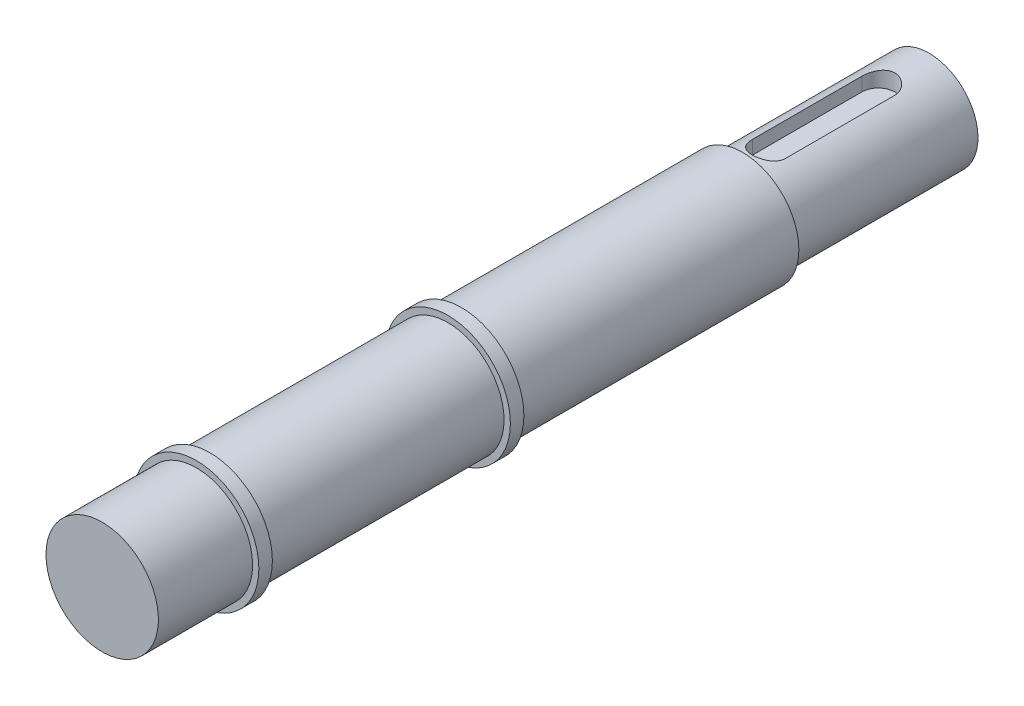
ISO-10303-21;
HEADER;
FILE_DESCRIPTION(('STEP AP214'),'2;1');
FILE_NAME('part.step','',(''),(''),'','','');
FILE_SCHEMA(('AUTOMOTIVE_DESIGN { 1 0 10303 214 1 1 1 1 }'));
ENDSEC;
DATA;
#1=APPLICATION_CONTEXT('core data for automotive mechanical design processes');
#2=APPLICATION_PROTOCOL_DEFINITION('international standard','automotive_design',2000,#1);
#3=PRODUCT_CONTEXT('',#1,'mechanical');
#4=PRODUCT('Part','Part','',(#3));
#5=PRODUCT_RELATED_PRODUCT_CATEGORY('part','',(#4));
#6=PRODUCT_DEFINITION_FORMATION('','',#4);
#7=PRODUCT_DEFINITION_CONTEXT('part definition',#1,'design');
#8=PRODUCT_DEFINITION('design','',#6,#7);
#9=PRODUCT_DEFINITION_SHAPE('','',#8);
#10=(LENGTH_UNIT() NAMED_UNIT(*) SI_UNIT(.MILLI.,.METRE.));
#11=(NAMED_UNIT(*) PLANE_ANGLE_UNIT() SI_UNIT($,.RADIAN.));
#12=(NAMED_UNIT(*) SI_UNIT($,.STERADIAN.) SOLID_ANGLE_UNIT());
#13=UNCERTAINTY_MEASURE_WITH_UNIT(LENGTH_MEASURE(1.E-05),#10,'distance_accuracy_value','');
#14=(GEOMETRIC_REPRESENTATION_CONTEXT(3) GLOBAL_UNCERTAINTY_ASSIGNED_CONTEXT((#13)) GLOBAL_UNIT_ASSIGNED_CONTEXT((#10,
#11,#12)) REPRESENTATION_CONTEXT('',''));
#15=CARTESIAN_POINT('',(0.,0.,0.));
#16=DIRECTION('',(0.,0.,1.));
#17=DIRECTION('',(1.,0.,0.));
#18=AXIS2_PLACEMENT_3D('',#15,#16,#17);
#19=CARTESIAN_POINT('',(0.,0.,28.2));
#20=DIRECTION('',(0.,0.,-1.));
#21=DIRECTION('',(-1.,0.,0.));
#22=AXIS2_PLACEMENT_3D('',#19,#20,#21);
#23=CYLINDRICAL_SURFACE('',#22,7.4);
#24=DIRECTION('',(0.,0.,-1.));
#25=VECTOR('',#24,1.);
#26=CARTESIAN_POINT('',(2.5,6.96491205974634,28.2));
#27=LINE('',#26,#25);
#28=CARTESIAN_POINT('',(2.5,6.96491205974634,7.68));
#29=VERTEX_POINT('',#28);
#30=CARTESIAN_POINT('',(2.5,6.96491205974634,24.22));
#31=VERTEX_POINT('',#30);
#32=EDGE_CURVE('E11',#29,#31,#27,.F.);
#33=ORIENTED_EDGE('',*,*,#32,.T.);
#34=CARTESIAN_POINT('',(2.5,6.96491205974634,24.22));
#35=CARTESIAN_POINT('',(2.50000905201508,6.96490099553564,24.2881487457083));
#36=CARTESIAN_POINT('',(2.49721364918644,6.96591201051966,24.3562913237092));
#37=CARTESIAN_POINT('',(2.48608446544295,6.96989582076334,24.4920466583324));
#38=CARTESIAN_POINT('',(2.477752216073,6.9728680735242,24.559659556238));
#39=CARTESIAN_POINT('',(2.45565314341074,6.98068027824519,24.6936740733216));
#40=CARTESIAN_POINT('',(2.44190277101499,6.9855145755412,24.7600787284107));
#41=CARTESIAN_POINT('',(2.4091090544519,6.9968916649086,24.891401469386));
#42=CARTESIAN_POINT('',(2.39006551123127,7.00343452123096,24.9563194992674));
#43=CARTESIAN_POINT('',(2.3252510474556,7.02533354142691,25.1480996033513));
#44=CARTESIAN_POINT('',(2.27176245812699,7.04297288735097,25.2721903451324));
#45=CARTESIAN_POINT('',(2.1459008277996,7.08233245659287,25.5096574609637));
#46=CARTESIAN_POINT('',(2.07351579187872,7.10405526951789,25.6230269669881));
#47=CARTESIAN_POINT('',(1.90880619240687,7.15010622199947,25.8404039046637));
#48=CARTESIAN_POINT('',(1.81585339491792,7.17450029768077,25.9439223346005));
#49=CARTESIAN_POINT('',(1.61398835009127,7.22258918638203,26.1342345624955));
#50=CARTESIAN_POINT('',(1.50507324397857,7.24628387322957,26.2210253581528));
#51=CARTESIAN_POINT('',(1.27075774894395,7.29107390182166,26.3776734405403));
#52=CARTESIAN_POINT('',(1.14499277113211,7.31208219485036,26.4470125212592));
#53=CARTESIAN_POINT('',(0.882756710640086,7.34834863330584,26.5633520209235));
#54=CARTESIAN_POINT('',(0.746288987487378,7.36360857444689,26.6103594172122));
#55=CARTESIAN_POINT('',(0.471681326765319,7.38619052820582,26.6790296926152));
#56=CARTESIAN_POINT('',(0.333774516869893,7.39377617782154,26.7015365024354));
#57=CARTESIAN_POINT('',(0.0559443345347075,7.40109182518934,26.7232522816952));
#58=CARTESIAN_POINT('',(-0.0839785347765379,7.4008237501077,26.7224669666132));
#59=CARTESIAN_POINT('',(-0.355883067176352,7.39263937184996,26.6981507005727));
#60=CARTESIAN_POINT('',(-0.487957589052036,7.38503155390528,26.6755371574892));
#61=CARTESIAN_POINT('',(-0.746311417471459,7.36341175453473,26.6097265113034));
#62=CARTESIAN_POINT('',(-0.872590400686251,7.34939941628203,26.5665282613215));
#63=CARTESIAN_POINT('',(-1.11775267963212,7.31615674421397,26.4602503137716));
#64=CARTESIAN_POINT('',(-1.2365149212717,7.29685933030961,26.3969132180546));
#65=CARTESIAN_POINT('',(-1.46199280086729,7.25504968839476,26.2523689154533));
#66=CARTESIAN_POINT('',(-1.56870507453878,7.23253656653045,26.1711567365175));
#67=CARTESIAN_POINT('',(-1.772498321968,7.18538231878151,25.9885745912751));
#68=CARTESIAN_POINT('',(-1.86886721852632,7.16069092634078,25.8864217381312));
#69=CARTESIAN_POINT('',(-2.04335729677368,7.11286852392247,25.6671773597069));
#70=CARTESIAN_POINT('',(-2.12147247820508,7.08973802880621,25.550080941764));
#71=CARTESIAN_POINT('',(-2.25827380149303,7.04737003113004,25.3019363479464));
#72=CARTESIAN_POINT('',(-2.31664000866284,7.02819843072747,25.1707000440184));
#73=CARTESIAN_POINT('',(-2.41013378070368,6.99669406129353,24.8995176564333));
#74=CARTESIAN_POINT('',(-2.44529822962789,6.9843504428298,24.759585785638));
#75=CARTESIAN_POINT('',(-2.47876836120455,6.97250403910819,24.5519003570336));
#76=CARTESIAN_POINT('',(-2.48672657738471,6.96966537453545,24.4857634688176));
#77=CARTESIAN_POINT('',(-2.49733912303956,6.96586795311158,24.3530962991924));
#78=CARTESIAN_POINT('',(-2.50000013259014,6.9649068286053,24.2865666194979));
#79=CARTESIAN_POINT('',(-2.5,6.96491205974634,24.22));
#80=B_SPLINE_CURVE_WITH_KNOTS('',3,(#34,#35,#36,#37,#38,#39,#40,#41,#42,#43,#44,#45,#46,#47,#48,
#49,#50,#51,#52,#53,#54,#55,#56,#57,#58,#59,#60,#61,#62,#63,#64,#65,#66,#67,#68,#69,#70,#71,#72,
#73,#74,#75,#76,#77,#78,#79),.UNSPECIFIED.,.F.,.F.,(4,2,2,2,2,2,2,2,2,2,2,2,2,2,2,2,2,2,2,2,2,2,
4),(0.,0.204371018640674,0.408685529814375,0.612384408444618,0.8160909483459,1.22289423224872,
1.62995637376861,2.05178960782396,2.4736984827744,2.90695459585444,3.34007525260528,
3.75775237270153,4.17532700301721,4.57608283473384,4.97686099722023,5.38298269457204,
5.78921749996541,6.21503140184729,6.6409850785764,7.07354137650675,7.50540836815663,
7.70522789621864,7.90479528057056),.UNSPECIFIED.);
#81=CARTESIAN_POINT('',(-2.5,6.96491205974634,24.22));
#82=VERTEX_POINT('',#81);
#83=EDGE_CURVE('E113',#31,#82,#80,.T.);
#84=ORIENTED_EDGE('',*,*,#83,.T.);
#85=DIRECTION('',(0.,0.,-1.));
#86=VECTOR('',#85,1.);
#87=CARTESIAN_POINT('',(-2.5,6.96491205974634,28.2));
#88=LINE('',#87,#86);
#89=CARTESIAN_POINT('',(-2.5,6.96491205974634,7.68));
#90=VERTEX_POINT('',#89);
#91=EDGE_CURVE('E45',#82,#90,#88,.T.);
#92=ORIENTED_EDGE('',*,*,#91,.T.);
#93=CARTESIAN_POINT('',(-2.5,6.96491205974634,7.68));
#94=CARTESIAN_POINT('',(-2.50000905201508,6.96490099553564,7.61185125429169));
#95=CARTESIAN_POINT('',(-2.49721364918644,6.96591201051967,7.54370867629081));
#96=CARTESIAN_POINT('',(-2.48608446544294,6.96989582076334,7.4079533416676));
#97=CARTESIAN_POINT('',(-2.47775221607299,6.9728680735242,7.340340443762));
#98=CARTESIAN_POINT('',(-2.45565314341073,6.98068027824519,7.20632592667837));
#99=CARTESIAN_POINT('',(-2.44190277101499,6.9855145755412,7.13992127158931));
#100=CARTESIAN_POINT('',(-2.4091090544519,6.9968916649086,7.00859853061398));
#101=CARTESIAN_POINT('',(-2.39006551123127,7.00343452123096,6.94368050073264));
#102=CARTESIAN_POINT('',(-2.3252510474556,7.02533354142691,6.75190039664868));
#103=CARTESIAN_POINT('',(-2.27176245812698,7.04297288735097,6.62780965486765));
#104=CARTESIAN_POINT('',(-2.14590082779959,7.08233245659287,6.3903425390363));
#105=CARTESIAN_POINT('',(-2.07351579187872,7.10405526951789,6.27697303301191));
#106=CARTESIAN_POINT('',(-1.90880619240686,7.15010622199947,6.05959609533636));
#107=CARTESIAN_POINT('',(-1.81585339491791,7.17450029768077,5.95607766539949));
#108=CARTESIAN_POINT('',(-1.61398835009127,7.22258918638203,5.76576543750455));
#109=CARTESIAN_POINT('',(-1.50507324397857,7.24628387322957,5.67897464184716));
#110=CARTESIAN_POINT('',(-1.27075774894394,7.29107390182166,5.52232655945967));
#111=CARTESIAN_POINT('',(-1.1449927711321,7.31208219485036,5.45298747874086));
#112=CARTESIAN_POINT('',(-0.882756710640081,7.34834863330584,5.33664797907653));
#113=CARTESIAN_POINT('',(-0.746288987487374,7.3636085744469,5.28964058278776));
#114=CARTESIAN_POINT('',(-0.471681326765316,7.38619052820582,5.22097030738481));
#115=CARTESIAN_POINT('',(-0.33377451686989,7.39377617782154,5.19846349756462));
#116=CARTESIAN_POINT('',(-0.0559443345347042,7.40109182518934,5.17674771830477));
#117=CARTESIAN_POINT('',(0.083978534776541,7.4008237501077,5.17753303338679));
#118=CARTESIAN_POINT('',(0.355883067176355,7.39263937184996,5.20184929942733));
#119=CARTESIAN_POINT('',(0.487957589052039,7.38503155390528,5.22446284251076));
#120=CARTESIAN_POINT('',(0.746311417471461,7.36341175453473,5.29027348869666));
#121=CARTESIAN_POINT('',(0.872590400686254,7.34939941628203,5.3334717386785));
#122=CARTESIAN_POINT('',(1.11775267963212,7.31615674421397,5.43974968622844));
#123=CARTESIAN_POINT('',(1.2365149212717,7.29685933030961,5.50308678194546));
#124=CARTESIAN_POINT('',(1.46199280086729,7.25504968839476,5.64763108454667));
#125=CARTESIAN_POINT('',(1.56870507453878,7.23253656653045,5.72884326348254));
#126=CARTESIAN_POINT('',(1.772498321968,7.18538231878151,5.91142540872492));
#127=CARTESIAN_POINT('',(1.86886721852632,7.16069092634077,6.01357826186878));
#128=CARTESIAN_POINT('',(2.04335729677368,7.11286852392247,6.23282264029312));
#129=CARTESIAN_POINT('',(2.12147247820508,7.08973802880621,6.34991905823603));
#130=CARTESIAN_POINT('',(2.25827380149303,7.04737003113004,6.59806365205365));
#131=CARTESIAN_POINT('',(2.31664000866284,7.02819843072747,6.72929995598166));
#132=CARTESIAN_POINT('',(2.41013378070368,6.99669406129353,7.00048234356673));
#133=CARTESIAN_POINT('',(2.4452982296279,6.9843504428298,7.14041421436197));
#134=CARTESIAN_POINT('',(2.47876836120455,6.97250403910819,7.34809964296641));
#135=CARTESIAN_POINT('',(2.48672657738471,6.96966537453545,7.41423653118241));
#136=CARTESIAN_POINT('',(2.49733912303956,6.96586795311157,7.54690370080764));
#137=CARTESIAN_POINT('',(2.50000013259014,6.9649068286053,7.61343338050215));
#138=CARTESIAN_POINT('',(2.5,6.96491205974634,7.68));
#139=B_SPLINE_CURVE_WITH_KNOTS('',3,(#93,#94,#95,#96,#97,#98,#99,#100,#101,#102,#103,#104,#105,
#106,#107,#108,#109,#110,#111,#112,#113,#114,#115,#116,#117,#118,#119,#120,#121,#122,#123,#124,
#125,#126,#127,#128,#129,#130,#131,#132,#133,#134,#135,#136,#137,#138),.UNSPECIFIED.,.F.,.F.,(4,
2,2,2,2,2,2,2,2,2,2,2,2,2,2,2,2,2,2,2,2,2,4),(0.,0.204371018640675,0.408685529814376,
0.61238440844462,0.8160909483459,1.22289423224873,1.62995637376861,2.05178960782396,
2.4736984827744,2.90695459585444,3.34007525260528,3.75775237270153,4.17532700301721,
4.57608283473384,4.97686099722023,5.38298269457203,5.78921749996541,6.21503140184728,
6.64098507857639,7.07354137650674,7.50540836815663,7.70522789621863,7.90479528057055),.UNSPECIFIED.);
#140=EDGE_CURVE('E52',#90,#29,#139,.T.);
#141=ORIENTED_EDGE('',*,*,#140,.T.);
#142=EDGE_LOOP('',(#33,#84,#92,#141));
#143=FACE_BOUND('',#142,.T.);
#144=CARTESIAN_POINT('',(0.,0.,28.2));
#145=DIRECTION('',(0.,0.,1.));
#146=DIRECTION('',(1.,0.,0.));
#147=AXIS2_PLACEMENT_3D('',#144,#145,#146);
#148=CIRCLE('',#147,7.4);
#149=CARTESIAN_POINT('',(7.4,0.,28.2));
#150=VERTEX_POINT('',#149);
#151=EDGE_CURVE('E126',#150,#150,#148,.T.);
#152=ORIENTED_EDGE('',*,*,#151,.F.);
#153=EDGE_LOOP('',(#152));
#154=FACE_BOUND('',#153,.T.);
#155=CARTESIAN_POINT('',(0.,0.,0.));
#156=DIRECTION('',(0.,0.,1.));
#157=DIRECTION('',(1.,0.,0.));
#158=AXIS2_PLACEMENT_3D('',#155,#156,#157);
#159=CIRCLE('',#158,7.4);
#160=CARTESIAN_POINT('',(7.4,0.,0.));
#161=VERTEX_POINT('',#160);
#162=EDGE_CURVE('E136',#161,#161,#159,.T.);
#163=ORIENTED_EDGE('',*,*,#162,.T.);
#164=EDGE_LOOP('',(#163));
#165=FACE_BOUND('',#164,.T.);
#166=ADVANCED_FACE('F37',(#143,#154,#165),#23,.T.);
#167=CARTESIAN_POINT('',(0.,0.,0.));
#168=DIRECTION('',(0.,0.,1.));
#169=DIRECTION('',(1.,0.,0.));
#170=AXIS2_PLACEMENT_3D('',#167,#168,#169);
#171=PLANE('',#170);
#172=ORIENTED_EDGE('',*,*,#162,.F.);
#173=EDGE_LOOP('',(#172));
#174=FACE_BOUND('',#173,.T.);
#175=ADVANCED_FACE('F209',(#174),#171,.F.);
#176=CARTESIAN_POINT('',(0.,0.,70.75));
#177=DIRECTION('',(0.,0.,-1.));
#178=DIRECTION('',(-1.,0.,0.));
#179=AXIS2_PLACEMENT_3D('',#176,#177,#178);
#180=CYLINDRICAL_SURFACE('',#179,8.5);
#181=CARTESIAN_POINT('',(0.,0.,70.75));
#182=DIRECTION('',(0.,0.,1.));
#183=DIRECTION('',(1.,0.,0.));
#184=AXIS2_PLACEMENT_3D('',#181,#182,#183);
#185=CIRCLE('',#184,8.5);
#186=CARTESIAN_POINT('',(8.5,0.,70.75));
#187=VERTEX_POINT('',#186);
#188=EDGE_CURVE('E133',#187,#187,#185,.T.);
#189=ORIENTED_EDGE('',*,*,#188,.F.);
#190=EDGE_LOOP('',(#189));
#191=FACE_BOUND('',#190,.T.);
#192=CARTESIAN_POINT('',(0.,0.,28.2));
#193=DIRECTION('',(0.,0.,1.));
#194=DIRECTION('',(1.,0.,0.));
#195=AXIS2_PLACEMENT_3D('',#192,#193,#194);
#196=CIRCLE('',#195,8.5);
#197=CARTESIAN_POINT('',(8.5,0.,28.2));
#198=VERTEX_POINT('',#197);
#199=EDGE_CURVE('E130',#198,#198,#196,.T.);
#200=ORIENTED_EDGE('',*,*,#199,.T.);
#201=EDGE_LOOP('',(#200));
#202=FACE_BOUND('',#201,.T.);
#203=ADVANCED_FACE('F206',(#191,#202),#180,.T.);
#204=CARTESIAN_POINT('',(0.,0.,28.2));
#205=DIRECTION('',(0.,0.,1.));
#206=DIRECTION('',(1.,0.,0.));
#207=AXIS2_PLACEMENT_3D('',#204,#205,#206);
#208=PLANE('',#207);
#209=ORIENTED_EDGE('',*,*,#151,.T.);
#210=EDGE_LOOP('',(#209));
#211=FACE_BOUND('',#210,.T.);
#212=ORIENTED_EDGE('',*,*,#199,.F.);
#213=EDGE_LOOP('',(#212));
#214=FACE_BOUND('',#213,.T.);
#215=ADVANCED_FACE('F202',(#211,#214),#208,.F.);
#216=CARTESIAN_POINT('',(0.,0.,72.8));
#217=DIRECTION('',(0.,0.,-1.));
#218=DIRECTION('',(-1.,0.,0.));
#219=AXIS2_PLACEMENT_3D('',#216,#217,#218);
#220=CYLINDRICAL_SURFACE('',#219,9.45);
#221=CARTESIAN_POINT('',(0.,0.,72.8));
#222=DIRECTION('',(0.,0.,1.));
#223=DIRECTION('',(1.,0.,0.));
#224=AXIS2_PLACEMENT_3D('',#221,#222,#223);
#225=CIRCLE('',#224,9.45);
#226=CARTESIAN_POINT('',(9.45,0.,72.8));
#227=VERTEX_POINT('',#226);
#228=EDGE_CURVE('E127',#227,#227,#225,.T.);
#229=ORIENTED_EDGE('',*,*,#228,.F.);
#230=EDGE_LOOP('',(#229));
#231=FACE_BOUND('',#230,.T.);
#232=CARTESIAN_POINT('',(0.,0.,70.75));
#233=DIRECTION('',(0.,0.,1.));
#234=DIRECTION('',(1.,0.,0.));
#235=AXIS2_PLACEMENT_3D('',#232,#233,#234);
#236=CIRCLE('',#235,9.45);
#237=CARTESIAN_POINT('',(9.45,0.,70.75));
#238=VERTEX_POINT('',#237);
#239=EDGE_CURVE('E123',#238,#238,#236,.T.);
#240=ORIENTED_EDGE('',*,*,#239,.T.);
#241=EDGE_LOOP('',(#240));
#242=FACE_BOUND('',#241,.T.);
#243=ADVANCED_FACE('F195',(#231,#242),#220,.T.);
#244=CARTESIAN_POINT('',(0.,0.,72.8));
#245=DIRECTION('',(0.,0.,1.));
#246=DIRECTION('',(1.,0.,0.));
#247=AXIS2_PLACEMENT_3D('',#244,#245,#246);
#248=PLANE('',#247);
#249=CARTESIAN_POINT('',(0.,0.,72.8));
#250=DIRECTION('',(0.,0.,1.));
#251=DIRECTION('',(1.,0.,0.));
#252=AXIS2_PLACEMENT_3D('',#249,#250,#251);
#253=CIRCLE('',#252,8.5);
#254=CARTESIAN_POINT('',(8.5,0.,72.8));
#255=VERTEX_POINT('',#254);
#256=EDGE_CURVE('E114',#255,#255,#253,.T.);
#257=ORIENTED_EDGE('',*,*,#256,.F.);
#258=EDGE_LOOP('',(#257));
#259=FACE_BOUND('',#258,.T.);
#260=ORIENTED_EDGE('',*,*,#228,.T.);
#261=EDGE_LOOP('',(#260));
#262=FACE_BOUND('',#261,.T.);
#263=ADVANCED_FACE('F192',(#259,#262),#248,.T.);
#264=CARTESIAN_POINT('',(0.,0.,70.75));
#265=DIRECTION('',(0.,0.,1.));
#266=DIRECTION('',(1.,0.,0.));
#267=AXIS2_PLACEMENT_3D('',#264,#265,#266);
#268=PLANE('',#267);
#269=ORIENTED_EDGE('',*,*,#188,.T.);
#270=EDGE_LOOP('',(#269));
#271=FACE_BOUND('',#270,.T.);
#272=ORIENTED_EDGE('',*,*,#239,.F.);
#273=EDGE_LOOP('',(#272));
#274=FACE_BOUND('',#273,.T.);
#275=ADVANCED_FACE('F190',(#271,#274),#268,.F.);
#276=CARTESIAN_POINT('',(0.,0.,108.8));
#277=DIRECTION('',(0.,0.,-1.));
#278=DIRECTION('',(-1.,0.,0.));
#279=AXIS2_PLACEMENT_3D('',#276,#277,#278);
#280=CYLINDRICAL_SURFACE('',#279,8.5);
#281=CARTESIAN_POINT('',(0.,0.,108.8));
#282=DIRECTION('',(0.,0.,1.));
#283=DIRECTION('',(1.,0.,0.));
#284=AXIS2_PLACEMENT_3D('',#281,#282,#283);
#285=CIRCLE('',#284,8.5);
#286=CARTESIAN_POINT('',(8.5,0.,108.8));
#287=VERTEX_POINT('',#286);
#288=EDGE_CURVE('E118',#287,#287,#285,.T.);
#289=ORIENTED_EDGE('',*,*,#288,.F.);
#290=EDGE_LOOP('',(#289));
#291=FACE_BOUND('',#290,.T.);
#292=ORIENTED_EDGE('',*,*,#256,.T.);
#293=EDGE_LOOP('',(#292));
#294=FACE_BOUND('',#293,.T.);
#295=ADVANCED_FACE('F186',(#291,#294),#280,.T.);
#296=CARTESIAN_POINT('',(0.,0.,110.85));
#297=DIRECTION('',(0.,0.,-1.));
#298=DIRECTION('',(-1.,0.,0.));
#299=AXIS2_PLACEMENT_3D('',#296,#297,#298);
#300=CYLINDRICAL_SURFACE('',#299,9.45);
#301=CARTESIAN_POINT('',(0.,0.,110.85));
#302=DIRECTION('',(0.,0.,1.));
#303=DIRECTION('',(1.,0.,0.));
#304=AXIS2_PLACEMENT_3D('',#301,#302,#303);
#305=CIRCLE('',#304,9.45);
#306=CARTESIAN_POINT('',(9.45,0.,110.85));
#307=VERTEX_POINT('',#306);
#308=EDGE_CURVE('E115',#307,#307,#305,.T.);
#309=ORIENTED_EDGE('',*,*,#308,.F.);
#310=EDGE_LOOP('',(#309));
#311=FACE_BOUND('',#310,.T.);
#312=CARTESIAN_POINT('',(0.,0.,108.8));
#313=DIRECTION('',(0.,0.,1.));
#314=DIRECTION('',(1.,0.,0.));
#315=AXIS2_PLACEMENT_3D('',#312,#313,#314);
#316=CIRCLE('',#315,9.45);
#317=CARTESIAN_POINT('',(9.45,0.,108.8));
#318=VERTEX_POINT('',#317);
#319=EDGE_CURVE('E109',#318,#318,#316,.T.);
#320=ORIENTED_EDGE('',*,*,#319,.T.);
#321=EDGE_LOOP('',(#320));
#322=FACE_BOUND('',#321,.T.);
#323=ADVANCED_FACE('F179',(#311,#322),#300,.T.);
#324=CARTESIAN_POINT('',(0.,0.,110.85));
#325=DIRECTION('',(0.,0.,1.));
#326=DIRECTION('',(1.,0.,0.));
#327=AXIS2_PLACEMENT_3D('',#324,#325,#326);
#328=PLANE('',#327);
#329=CARTESIAN_POINT('',(0.,0.,110.85));
#330=DIRECTION('',(0.,0.,1.));
#331=DIRECTION('',(1.,0.,0.));
#332=AXIS2_PLACEMENT_3D('',#329,#330,#331);
#333=CIRCLE('',#332,8.5);
#334=CARTESIAN_POINT('',(-8.5,0.,110.85));
#335=VERTEX_POINT('',#334);
#336=EDGE_CURVE('E110',#335,#335,#333,.T.);
#337=ORIENTED_EDGE('',*,*,#336,.F.);
#338=EDGE_LOOP('',(#337));
#339=FACE_BOUND('',#338,.T.);
#340=ORIENTED_EDGE('',*,*,#308,.T.);
#341=EDGE_LOOP('',(#340));
#342=FACE_BOUND('',#341,.T.);
#343=ADVANCED_FACE('F176',(#339,#342),#328,.T.);
#344=CARTESIAN_POINT('',(0.,0.,108.8));
#345=DIRECTION('',(0.,0.,1.));
#346=DIRECTION('',(1.,0.,0.));
#347=AXIS2_PLACEMENT_3D('',#344,#345,#346);
#348=PLANE('',#347);
#349=ORIENTED_EDGE('',*,*,#288,.T.);
#350=EDGE_LOOP('',(#349));
#351=FACE_BOUND('',#350,.T.);
#352=ORIENTED_EDGE('',*,*,#319,.F.);
#353=EDGE_LOOP('',(#352));
#354=FACE_BOUND('',#353,.T.);
#355=ADVANCED_FACE('F174',(#351,#354),#348,.F.);
#356=CARTESIAN_POINT('',(0.,0.,125.1));
#357=DIRECTION('',(0.,0.,-1.));
#358=DIRECTION('',(-1.,0.,0.));
#359=AXIS2_PLACEMENT_3D('',#356,#357,#358);
#360=CYLINDRICAL_SURFACE('',#359,8.5);
#361=CARTESIAN_POINT('',(0.,0.,125.1));
#362=DIRECTION('',(0.,0.,1.));
#363=DIRECTION('',(1.,0.,0.));
#364=AXIS2_PLACEMENT_3D('',#361,#362,#363);
#365=CIRCLE('',#364,8.5);
#366=CARTESIAN_POINT('',(-8.5,0.,125.1));
#367=VERTEX_POINT('',#366);
#368=EDGE_CURVE('E103',#367,#367,#365,.T.);
#369=CARTESIAN_POINT('',(-8.5,0.,125.1));
#370=CARTESIAN_POINT('',(-8.5,0.,124.9515625));
#371=CARTESIAN_POINT('',(-8.5,0.,124.803125));
#372=CARTESIAN_POINT('',(-8.5,0.,124.50625));
#373=CARTESIAN_POINT('',(-8.5,0.,124.3578125));
#374=CARTESIAN_POINT('',(-8.5,0.,124.0609375));
#375=CARTESIAN_POINT('',(-8.5,0.,123.9125));
#376=CARTESIAN_POINT('',(-8.5,0.,123.615625));
#377=CARTESIAN_POINT('',(-8.5,0.,123.4671875));
#378=CARTESIAN_POINT('',(-8.5,0.,123.1703125));
#379=CARTESIAN_POINT('',(-8.5,0.,123.021875));
#380=CARTESIAN_POINT('',(-8.5,0.,122.725));
#381=CARTESIAN_POINT('',(-8.5,0.,122.5765625));
#382=CARTESIAN_POINT('',(-8.5,0.,122.2796875));
#383=CARTESIAN_POINT('',(-8.5,0.,122.13125));
#384=CARTESIAN_POINT('',(-8.5,0.,121.834375));
#385=CARTESIAN_POINT('',(-8.5,0.,121.6859375));
#386=CARTESIAN_POINT('',(-8.5,0.,121.3890625));
#387=CARTESIAN_POINT('',(-8.5,0.,121.240625));
#388=CARTESIAN_POINT('',(-8.5,0.,120.94375));
#389=CARTESIAN_POINT('',(-8.5,0.,120.7953125));
#390=CARTESIAN_POINT('',(-8.5,0.,120.4984375));
#391=CARTESIAN_POINT('',(-8.5,0.,120.35));
#392=CARTESIAN_POINT('',(-8.5,0.,120.053125));
#393=CARTESIAN_POINT('',(-8.5,0.,119.9046875));
#394=CARTESIAN_POINT('',(-8.5,0.,119.6078125));
#395=CARTESIAN_POINT('',(-8.5,0.,119.459375));
#396=CARTESIAN_POINT('',(-8.5,0.,119.1625));
#397=CARTESIAN_POINT('',(-8.5,0.,119.0140625));
#398=CARTESIAN_POINT('',(-8.5,0.,118.7171875));
#399=CARTESIAN_POINT('',(-8.5,0.,118.56875));
#400=CARTESIAN_POINT('',(-8.5,0.,118.271875));
#401=CARTESIAN_POINT('',(-8.5,0.,118.1234375));
#402=CARTESIAN_POINT('',(-8.5,0.,117.8265625));
#403=CARTESIAN_POINT('',(-8.5,0.,117.678125));
#404=CARTESIAN_POINT('',(-8.5,0.,117.38125));
#405=CARTESIAN_POINT('',(-8.5,0.,117.2328125));
#406=CARTESIAN_POINT('',(-8.5,0.,116.9359375));
#407=CARTESIAN_POINT('',(-8.5,0.,116.7875));
#408=CARTESIAN_POINT('',(-8.5,0.,116.490625));
#409=CARTESIAN_POINT('',(-8.5,0.,116.3421875));
#410=CARTESIAN_POINT('',(-8.5,0.,116.0453125));
#411=CARTESIAN_POINT('',(-8.5,0.,115.896875));
#412=CARTESIAN_POINT('',(-8.5,0.,115.6));
#413=CARTESIAN_POINT('',(-8.5,0.,115.4515625));
#414=CARTESIAN_POINT('',(-8.5,0.,115.1546875));
#415=CARTESIAN_POINT('',(-8.5,0.,115.00625));
#416=CARTESIAN_POINT('',(-8.5,0.,114.709375));
#417=CARTESIAN_POINT('',(-8.5,0.,114.5609375));
#418=CARTESIAN_POINT('',(-8.5,0.,114.2640625));
#419=CARTESIAN_POINT('',(-8.5,0.,114.115625));
#420=CARTESIAN_POINT('',(-8.5,0.,113.81875));
#421=CARTESIAN_POINT('',(-8.5,0.,113.6703125));
#422=CARTESIAN_POINT('',(-8.5,0.,113.3734375));
#423=CARTESIAN_POINT('',(-8.5,0.,113.225));
#424=CARTESIAN_POINT('',(-8.5,0.,112.928125));
#425=CARTESIAN_POINT('',(-8.5,0.,112.7796875));
#426=CARTESIAN_POINT('',(-8.5,0.,112.4828125));
#427=CARTESIAN_POINT('',(-8.5,0.,112.334375));
#428=CARTESIAN_POINT('',(-8.5,0.,112.0375));
#429=CARTESIAN_POINT('',(-8.5,0.,111.8890625));
#430=CARTESIAN_POINT('',(-8.5,0.,111.5921875));
#431=CARTESIAN_POINT('',(-8.5,0.,111.44375));
#432=CARTESIAN_POINT('',(-8.5,0.,111.146875));
#433=CARTESIAN_POINT('',(-8.5,0.,110.9984375));
#434=CARTESIAN_POINT('',(-8.5,0.,110.85));
#435=B_SPLINE_CURVE_WITH_KNOTS('',3,(#369,#370,#371,#372,#373,#374,#375,#376,#377,#378,#379,
#380,#381,#382,#383,#384,#385,#386,#387,#388,#389,#390,#391,#392,#393,#394,#395,#396,#397,#398,
#399,#400,#401,#402,#403,#404,#405,#406,#407,#408,#409,#410,#411,#412,#413,#414,#415,#416,#417,
#418,#419,#420,#421,#422,#423,#424,#425,#426,#427,#428,#429,#430,#431,#432,#433,#434),
.UNSPECIFIED.,.F.,.F.,(4,2,2,2,2,2,2,2,2,2,2,2,2,2,2,2,2,2,2,2,2,2,2,2,2,2,2,2,2,2,2,2,4),(0.,
0.445312500000017,0.89062500000002,1.33593750000001,1.78125000000001,2.22656250000002,
2.67187500000002,3.11718750000001,3.56250000000001,4.00781250000001,4.45312500000002,
4.89843750000001,5.34375000000001,5.78906250000001,6.23437500000001,6.6796875,7.12500000000001,
7.57031250000001,8.01562500000001,8.4609375,8.90625,9.35156250000001,9.79687500000001,
10.2421875,10.6875,11.1328125,11.578125,12.0234375,12.46875,12.9140625,13.359375,13.8046875,
14.25),.UNSPECIFIED.);
#436=EDGE_CURVE('BSEAM170',#367,#335,#435,.T.);
#437=ORIENTED_EDGE('',*,*,#368,.F.);
#438=ORIENTED_EDGE('',*,*,#336,.T.);
#439=ORIENTED_EDGE('',*,*,#436,.T.);
#440=ORIENTED_EDGE('',*,*,#436,.F.);
#441=EDGE_LOOP('',(#437,#439,#438,#440));
#442=FACE_BOUND('',#441,.T.);
#443=ADVANCED_FACE('F170',(#442),#360,.T.);
#444=CARTESIAN_POINT('',(0.,0.,125.1));
#445=DIRECTION('',(0.,0.,1.));
#446=DIRECTION('',(1.,0.,0.));
#447=AXIS2_PLACEMENT_3D('',#444,#445,#446);
#448=PLANE('',#447);
#449=ORIENTED_EDGE('',*,*,#368,.T.);
#450=EDGE_LOOP('',(#449));
#451=FACE_BOUND('',#450,.T.);
#452=ADVANCED_FACE('F167',(#451),#448,.T.);
#453=CARTESIAN_POINT('',(0.,4.9,7.68));
#454=DIRECTION('',(0.,1.,0.));
#455=DIRECTION('',(0.,0.,1.));
#456=AXIS2_PLACEMENT_3D('',#453,#454,#455);
#457=CYLINDRICAL_SURFACE('',#456,2.5);
#458=DIRECTION('',(0.,1.,0.));
#459=VECTOR('',#458,1.);
#460=CARTESIAN_POINT('',(-2.5,4.9,7.68));
#461=LINE('',#460,#459);
#462=CARTESIAN_POINT('',(-2.5,4.9,7.68));
#463=VERTEX_POINT('',#462);
#464=EDGE_CURVE('E75',#463,#90,#461,.T.);
#465=ORIENTED_EDGE('',*,*,#464,.F.);
#466=CARTESIAN_POINT('',(0.,4.9,7.68));
#467=DIRECTION('',(0.,1.,0.));
#468=DIRECTION('',(0.,0.,1.));
#469=AXIS2_PLACEMENT_3D('',#466,#467,#468);
#470=CIRCLE('',#469,2.5);
#471=CARTESIAN_POINT('',(2.5,4.9,7.68));
#472=VERTEX_POINT('',#471);
#473=EDGE_CURVE('E79',#472,#463,#470,.T.);
#474=ORIENTED_EDGE('',*,*,#473,.F.);
#475=DIRECTION('',(0.,1.,0.));
#476=VECTOR('',#475,1.);
#477=CARTESIAN_POINT('',(2.5,4.9,7.68));
#478=LINE('',#477,#476);
#479=EDGE_CURVE('E101',#472,#29,#478,.T.);
#480=ORIENTED_EDGE('',*,*,#479,.T.);
#481=ORIENTED_EDGE('',*,*,#140,.F.);
#482=EDGE_LOOP('',(#465,#474,#480,#481));
#483=FACE_BOUND('',#482,.T.);
#484=ADVANCED_FACE('F77',(#483),#457,.F.);
#485=CARTESIAN_POINT('',(2.5,4.9,7.68));
#486=DIRECTION('',(1.,0.,0.));
#487=DIRECTION('',(0.,0.,-1.));
#488=AXIS2_PLACEMENT_3D('',#485,#486,#487);
#489=PLANE('',#488);
#490=ORIENTED_EDGE('',*,*,#479,.F.);
#491=DIRECTION('',(0.,0.,-1.));
#492=VECTOR('',#491,1.);
#493=CARTESIAN_POINT('',(2.5,4.9,7.68));
#494=LINE('',#493,#492);
#495=CARTESIAN_POINT('',(2.5,4.9,24.22));
#496=VERTEX_POINT('',#495);
#497=EDGE_CURVE('E84',#496,#472,#494,.T.);
#498=ORIENTED_EDGE('',*,*,#497,.F.);
#499=DIRECTION('',(0.,1.,0.));
#500=VECTOR('',#499,1.);
#501=CARTESIAN_POINT('',(2.5,4.9,24.22));
#502=LINE('',#501,#500);
#503=EDGE_CURVE('E104',#496,#31,#502,.T.);
#504=ORIENTED_EDGE('',*,*,#503,.T.);
#505=ORIENTED_EDGE('',*,*,#32,.F.);
#506=EDGE_LOOP('',(#490,#498,#504,#505));
#507=FACE_BOUND('',#506,.T.);
#508=ADVANCED_FACE('F160',(#507),#489,.F.);
#509=CARTESIAN_POINT('',(0.,4.9,24.22));
#510=DIRECTION('',(0.,1.,0.));
#511=DIRECTION('',(0.,0.,1.));
#512=AXIS2_PLACEMENT_3D('',#509,#510,#511);
#513=CYLINDRICAL_SURFACE('',#512,2.5);
#514=ORIENTED_EDGE('',*,*,#503,.F.);
#515=CARTESIAN_POINT('',(0.,4.9,24.22));
#516=DIRECTION('',(0.,1.,0.));
#517=DIRECTION('',(0.,0.,1.));
#518=AXIS2_PLACEMENT_3D('',#515,#516,#517);
#519=CIRCLE('',#518,2.5);
#520=CARTESIAN_POINT('',(-2.5,4.9,24.22));
#521=VERTEX_POINT('',#520);
#522=EDGE_CURVE('E93',#521,#496,#519,.T.);
#523=ORIENTED_EDGE('',*,*,#522,.F.);
#524=DIRECTION('',(0.,1.,0.));
#525=VECTOR('',#524,1.);
#526=CARTESIAN_POINT('',(-2.5,4.9,24.22));
#527=LINE('',#526,#525);
#528=EDGE_CURVE('E83',#521,#82,#527,.T.);
#529=ORIENTED_EDGE('',*,*,#528,.T.);
#530=ORIENTED_EDGE('',*,*,#83,.F.);
#531=EDGE_LOOP('',(#514,#523,#529,#530));
#532=FACE_BOUND('',#531,.T.);
#533=ADVANCED_FACE('F155',(#532),#513,.F.);
#534=CARTESIAN_POINT('',(-2.5,4.9,7.68));
#535=DIRECTION('',(-1.,0.,0.));
#536=DIRECTION('',(0.,0.,1.));
#537=AXIS2_PLACEMENT_3D('',#534,#535,#536);
#538=PLANE('',#537);
#539=ORIENTED_EDGE('',*,*,#528,.F.);
#540=DIRECTION('',(0.,0.,1.));
#541=VECTOR('',#540,1.);
#542=CARTESIAN_POINT('',(-2.5,4.9,7.68));
#543=LINE('',#542,#541);
#544=EDGE_CURVE('E87',#463,#521,#543,.T.);
#545=ORIENTED_EDGE('',*,*,#544,.F.);
#546=ORIENTED_EDGE('',*,*,#464,.T.);
#547=ORIENTED_EDGE('',*,*,#91,.F.);
#548=EDGE_LOOP('',(#539,#545,#546,#547));
#549=FACE_BOUND('',#548,.T.);
#550=ADVANCED_FACE('F88',(#549),#538,.F.);
#551=CARTESIAN_POINT('',(0.,4.9,7.68));
#552=DIRECTION('',(0.,1.,0.));
#553=DIRECTION('',(0.,0.,1.));
#554=AXIS2_PLACEMENT_3D('',#551,#552,#553);
#555=PLANE('',#554);
#556=ORIENTED_EDGE('',*,*,#473,.T.);
#557=ORIENTED_EDGE('',*,*,#544,.T.);
#558=ORIENTED_EDGE('',*,*,#522,.T.);
#559=ORIENTED_EDGE('',*,*,#497,.T.);
#560=EDGE_LOOP('',(#556,#557,#558,#559));
#561=FACE_BOUND('',#560,.T.);
#562=ADVANCED_FACE('F95',(#561),#555,.T.);
#563=CLOSED_SHELL('',(#166,#175,#203,#215,#243,#263,#275,#295,#323,#343,#355,#443,#452,#484,
#508,#533,#550,#562));
#564=MANIFOLD_SOLID_BREP('B2',#563);
#565=ADVANCED_BREP_SHAPE_REPRESENTATION('',(#18,#564),#14);
#566=SHAPE_DEFINITION_REPRESENTATION(#9,#565);
ENDSEC;
END-ISO-10303-21;
